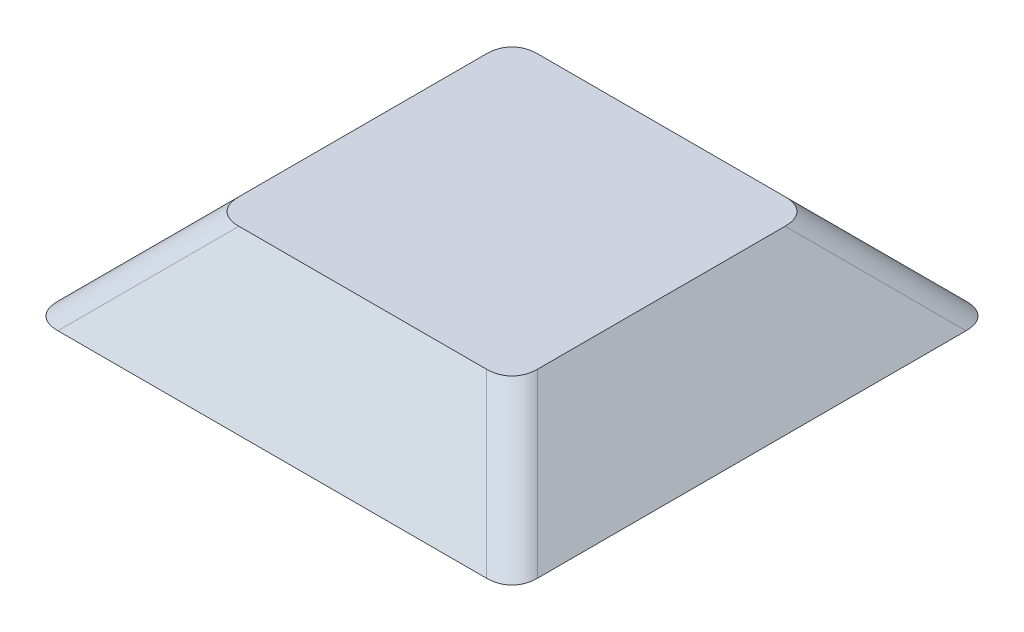
ISO-10303-21;
HEADER;
FILE_DESCRIPTION(('STEP AP214'),'2;1');
FILE_NAME('part.step','',(''),(''),'','','');
FILE_SCHEMA(('AUTOMOTIVE_DESIGN { 1 0 10303 214 1 1 1 1 }'));
ENDSEC;
DATA;
#1=APPLICATION_CONTEXT('core data for automotive mechanical design processes');
#2=APPLICATION_PROTOCOL_DEFINITION('international standard','automotive_design',2000,#1);
#3=PRODUCT_CONTEXT('',#1,'mechanical');
#4=PRODUCT('Part','Part','',(#3));
#5=PRODUCT_RELATED_PRODUCT_CATEGORY('part','',(#4));
#6=PRODUCT_DEFINITION_FORMATION('','',#4);
#7=PRODUCT_DEFINITION_CONTEXT('part definition',#1,'design');
#8=PRODUCT_DEFINITION('design','',#6,#7);
#9=PRODUCT_DEFINITION_SHAPE('','',#8);
#10=(LENGTH_UNIT() NAMED_UNIT(*) SI_UNIT(.MILLI.,.METRE.));
#11=(NAMED_UNIT(*) PLANE_ANGLE_UNIT() SI_UNIT($,.RADIAN.));
#12=(NAMED_UNIT(*) SI_UNIT($,.STERADIAN.) SOLID_ANGLE_UNIT());
#13=UNCERTAINTY_MEASURE_WITH_UNIT(LENGTH_MEASURE(1.E-05),#10,'distance_accuracy_value','');
#14=(GEOMETRIC_REPRESENTATION_CONTEXT(3) GLOBAL_UNCERTAINTY_ASSIGNED_CONTEXT((#13)) GLOBAL_UNIT_ASSIGNED_CONTEXT((#10,
#11,#12)) REPRESENTATION_CONTEXT('',''));
#15=CARTESIAN_POINT('',(0.,0.,0.));
#16=DIRECTION('',(0.,0.,1.));
#17=DIRECTION('',(1.,0.,0.));
#18=AXIS2_PLACEMENT_3D('',#15,#16,#17);
#19=CARTESIAN_POINT('',(0.,20.,0.));
#20=DIRECTION('',(0.,1.,0.));
#21=DIRECTION('',(0.,0.,1.));
#22=AXIS2_PLACEMENT_3D('',#19,#20,#21);
#23=PLANE('',#22);
#24=DIRECTION('',(-1.,0.,0.));
#25=VECTOR('',#24,1.);
#26=CARTESIAN_POINT('',(-53.,20.,-32.9999999999999));
#27=LINE('',#26,#25);
#28=CARTESIAN_POINT('',(27.3431457505076,20.,-32.9999999999999));
#29=VERTEX_POINT('',#28);
#30=CARTESIAN_POINT('',(-27.3431457505075,20.,-32.9999999999999));
#31=VERTEX_POINT('',#30);
#32=EDGE_CURVE('E150',#29,#31,#27,.T.);
#33=ORIENTED_EDGE('',*,*,#32,.T.);
#34=CARTESIAN_POINT('',(-21.6862915010152,20.,-21.6862915010152));
#35=DIRECTION('',(0.,1.,0.));
#36=DIRECTION('',(-0.707106781186548,0.,-0.707106781186547));
#37=AXIS2_PLACEMENT_3D('',#34,#35,#36);
#38=ELLIPSE('',#37,13.856406460551,8.);
#39=CARTESIAN_POINT('',(-32.9999999999999,20.,-27.3431457505076));
#40=VERTEX_POINT('',#39);
#41=EDGE_CURVE('E167',#31,#40,#38,.T.);
#42=ORIENTED_EDGE('',*,*,#41,.T.);
#43=DIRECTION('',(0.,0.,1.));
#44=VECTOR('',#43,1.);
#45=CARTESIAN_POINT('',(-32.9999999999999,20.,53.));
#46=LINE('',#45,#44);
#47=CARTESIAN_POINT('',(-32.9999999999999,20.,27.3431457505075));
#48=VERTEX_POINT('',#47);
#49=EDGE_CURVE('E130',#40,#48,#46,.T.);
#50=ORIENTED_EDGE('',*,*,#49,.T.);
#51=CARTESIAN_POINT('',(-21.6862915010151,20.,21.6862915010151));
#52=DIRECTION('',(0.,1.,0.));
#53=DIRECTION('',(0.707106781186547,0.,-0.707106781186548));
#54=AXIS2_PLACEMENT_3D('',#51,#52,#53);
#55=ELLIPSE('',#54,13.856406460551,8.);
#56=CARTESIAN_POINT('',(-27.3431457505075,20.,32.9999999999999));
#57=VERTEX_POINT('',#56);
#58=EDGE_CURVE('E162',#48,#57,#55,.T.);
#59=ORIENTED_EDGE('',*,*,#58,.T.);
#60=DIRECTION('',(1.,0.,0.));
#61=VECTOR('',#60,1.);
#62=CARTESIAN_POINT('',(53.,20.,32.9999999999999));
#63=LINE('',#62,#61);
#64=CARTESIAN_POINT('',(27.3431457505075,20.,32.9999999999999));
#65=VERTEX_POINT('',#64);
#66=EDGE_CURVE('E141',#57,#65,#63,.T.);
#67=ORIENTED_EDGE('',*,*,#66,.T.);
#68=CARTESIAN_POINT('',(21.6862915010152,20.,21.6862915010151));
#69=DIRECTION('',(0.,1.,0.));
#70=DIRECTION('',(-0.707106781186548,0.,-0.707106781186548));
#71=AXIS2_PLACEMENT_3D('',#68,#69,#70);
#72=ELLIPSE('',#71,13.856406460551,8.);
#73=CARTESIAN_POINT('',(32.9999999999999,20.,27.3431457505075));
#74=VERTEX_POINT('',#73);
#75=EDGE_CURVE('E65',#65,#74,#72,.T.);
#76=ORIENTED_EDGE('',*,*,#75,.T.);
#77=DIRECTION('',(0.,0.,-1.));
#78=VECTOR('',#77,1.);
#79=CARTESIAN_POINT('',(32.9999999999999,20.,-53.));
#80=LINE('',#79,#78);
#81=CARTESIAN_POINT('',(32.9999999999999,20.,-27.3431457505076));
#82=VERTEX_POINT('',#81);
#83=EDGE_CURVE('E148',#74,#82,#80,.T.);
#84=ORIENTED_EDGE('',*,*,#83,.T.);
#85=CARTESIAN_POINT('',(21.6862915010152,20.,-21.6862915010152));
#86=DIRECTION('',(0.,1.,0.));
#87=DIRECTION('',(0.707106781186548,0.,-0.707106781186548));
#88=AXIS2_PLACEMENT_3D('',#85,#86,#87);
#89=ELLIPSE('',#88,13.856406460551,8.);
#90=EDGE_CURVE('E165',#82,#29,#89,.T.);
#91=ORIENTED_EDGE('',*,*,#90,.T.);
#92=EDGE_LOOP('',(#33,#42,#50,#59,#67,#76,#84,#91));
#93=FACE_BOUND('',#92,.T.);
#94=ADVANCED_FACE('F43',(#93),#23,.T.);
#95=CARTESIAN_POINT('',(0.,0.,0.));
#96=DIRECTION('',(0.,1.,0.));
#97=DIRECTION('',(0.,0.,1.));
#98=AXIS2_PLACEMENT_3D('',#95,#96,#97);
#99=PLANE('',#98);
#100=DIRECTION('',(0.,0.,1.));
#101=VECTOR('',#100,1.);
#102=CARTESIAN_POINT('',(-53.,0.,-53.));
#103=LINE('',#102,#101);
#104=CARTESIAN_POINT('',(-53.,0.,-47.3431457505076));
#105=VERTEX_POINT('',#104);
#106=CARTESIAN_POINT('',(-53.,0.,47.3431457505076));
#107=VERTEX_POINT('',#106);
#108=EDGE_CURVE('E127',#105,#107,#103,.T.);
#109=ORIENTED_EDGE('',*,*,#108,.F.);
#110=CARTESIAN_POINT('',(-41.6862915010152,0.,-41.6862915010152));
#111=DIRECTION('',(0.,1.,0.));
#112=DIRECTION('',(-0.707106781186548,0.,-0.707106781186547));
#113=AXIS2_PLACEMENT_3D('',#110,#111,#112);
#114=ELLIPSE('',#113,13.856406460551,8.);
#115=CARTESIAN_POINT('',(-47.3431457505076,0.,-53.));
#116=VERTEX_POINT('',#115);
#117=EDGE_CURVE('E109',#105,#116,#114,.F.);
#118=ORIENTED_EDGE('',*,*,#117,.T.);
#119=DIRECTION('',(-1.,0.,0.));
#120=VECTOR('',#119,1.);
#121=CARTESIAN_POINT('',(-53.,0.,-53.));
#122=LINE('',#121,#120);
#123=CARTESIAN_POINT('',(47.3431457505076,0.,-53.));
#124=VERTEX_POINT('',#123);
#125=EDGE_CURVE('E138',#124,#116,#122,.T.);
#126=ORIENTED_EDGE('',*,*,#125,.F.);
#127=CARTESIAN_POINT('',(41.6862915010152,0.,-41.6862915010152));
#128=DIRECTION('',(0.,1.,0.));
#129=DIRECTION('',(0.707106781186548,0.,-0.707106781186548));
#130=AXIS2_PLACEMENT_3D('',#127,#128,#129);
#131=ELLIPSE('',#130,13.856406460551,8.);
#132=CARTESIAN_POINT('',(53.,0.,-47.3431457505076));
#133=VERTEX_POINT('',#132);
#134=EDGE_CURVE('E120',#124,#133,#131,.F.);
#135=ORIENTED_EDGE('',*,*,#134,.T.);
#136=DIRECTION('',(0.,0.,-1.));
#137=VECTOR('',#136,1.);
#138=CARTESIAN_POINT('',(53.,0.,-53.));
#139=LINE('',#138,#137);
#140=CARTESIAN_POINT('',(53.,0.,47.3431457505076));
#141=VERTEX_POINT('',#140);
#142=EDGE_CURVE('E143',#141,#133,#139,.T.);
#143=ORIENTED_EDGE('',*,*,#142,.F.);
#144=CARTESIAN_POINT('',(41.6862915010152,0.,41.6862915010152));
#145=DIRECTION('',(0.,1.,0.));
#146=DIRECTION('',(-0.707106781186548,0.,-0.707106781186548));
#147=AXIS2_PLACEMENT_3D('',#144,#145,#146);
#148=ELLIPSE('',#147,13.856406460551,8.);
#149=CARTESIAN_POINT('',(47.3431457505076,0.,53.));
#150=VERTEX_POINT('',#149);
#151=EDGE_CURVE('E156',#141,#150,#148,.F.);
#152=ORIENTED_EDGE('',*,*,#151,.T.);
#153=DIRECTION('',(1.,0.,0.));
#154=VECTOR('',#153,1.);
#155=CARTESIAN_POINT('',(-53.,0.,53.));
#156=LINE('',#155,#154);
#157=CARTESIAN_POINT('',(-47.3431457505076,0.,53.));
#158=VERTEX_POINT('',#157);
#159=EDGE_CURVE('E137',#158,#150,#156,.T.);
#160=ORIENTED_EDGE('',*,*,#159,.F.);
#161=CARTESIAN_POINT('',(-41.6862915010151,0.,41.6862915010152));
#162=DIRECTION('',(0.,1.,0.));
#163=DIRECTION('',(0.707106781186547,0.,-0.707106781186548));
#164=AXIS2_PLACEMENT_3D('',#161,#162,#163);
#165=ELLIPSE('',#164,13.856406460551,8.);
#166=EDGE_CURVE('E131',#158,#107,#165,.F.);
#167=ORIENTED_EDGE('',*,*,#166,.T.);
#168=EDGE_LOOP('',(#109,#118,#126,#135,#143,#152,#160,#167));
#169=FACE_BOUND('',#168,.T.);
#170=ADVANCED_FACE('F134',(#169),#99,.F.);
#171=CARTESIAN_POINT('',(32.9999999999999,20.,0.));
#172=DIRECTION('',(0.707106781186547,0.707106781186548,0.));
#173=DIRECTION('',(0.,0.,1.));
#174=AXIS2_PLACEMENT_3D('',#171,#172,#173);
#175=PLANE('',#174);
#176=ORIENTED_EDGE('',*,*,#142,.T.);
#177=DIRECTION('',(0.577350269189626,-0.577350269189626,-0.577350269189626));
#178=VECTOR('',#177,1.);
#179=CARTESIAN_POINT('',(23.8856180831641,29.1143819168359,-18.2287638336717));
#180=LINE('',#179,#178);
#181=EDGE_CURVE('E58',#133,#82,#180,.F.);
#182=ORIENTED_EDGE('',*,*,#181,.T.);
#183=ORIENTED_EDGE('',*,*,#83,.F.);
#184=DIRECTION('',(-0.577350269189626,0.577350269189626,-0.577350269189626));
#185=VECTOR('',#184,1.);
#186=CARTESIAN_POINT('',(23.8856180831641,29.1143819168358,18.2287638336717));
#187=LINE('',#186,#185);
#188=EDGE_CURVE('E169',#74,#141,#187,.F.);
#189=ORIENTED_EDGE('',*,*,#188,.T.);
#190=EDGE_LOOP('',(#176,#182,#183,#189));
#191=FACE_BOUND('',#190,.T.);
#192=ADVANCED_FACE('F186',(#191),#175,.T.);
#193=CARTESIAN_POINT('',(0.,20.,-32.9999999999999));
#194=DIRECTION('',(0.,0.707106781186548,-0.707106781186547));
#195=DIRECTION('',(1.,0.,0.));
#196=AXIS2_PLACEMENT_3D('',#193,#194,#195);
#197=PLANE('',#196);
#198=ORIENTED_EDGE('',*,*,#125,.T.);
#199=DIRECTION('',(-0.577350269189626,-0.577350269189626,-0.577350269189626));
#200=VECTOR('',#199,1.);
#201=CARTESIAN_POINT('',(-18.2287638336717,29.1143819168358,-23.8856180831641));
#202=LINE('',#201,#200);
#203=EDGE_CURVE('E114',#116,#31,#202,.F.);
#204=ORIENTED_EDGE('',*,*,#203,.T.);
#205=ORIENTED_EDGE('',*,*,#32,.F.);
#206=DIRECTION('',(0.577350269189626,-0.577350269189626,-0.577350269189626));
#207=VECTOR('',#206,1.);
#208=CARTESIAN_POINT('',(18.2287638336717,29.1143819168358,-23.8856180831641));
#209=LINE('',#208,#207);
#210=EDGE_CURVE('E119',#29,#124,#209,.T.);
#211=ORIENTED_EDGE('',*,*,#210,.T.);
#212=EDGE_LOOP('',(#198,#204,#205,#211));
#213=FACE_BOUND('',#212,.T.);
#214=ADVANCED_FACE('F183',(#213),#197,.T.);
#215=CARTESIAN_POINT('',(0.,20.,32.9999999999999));
#216=DIRECTION('',(0.,0.707106781186548,0.707106781186547));
#217=DIRECTION('',(-1.,0.,0.));
#218=AXIS2_PLACEMENT_3D('',#215,#216,#217);
#219=PLANE('',#218);
#220=ORIENTED_EDGE('',*,*,#159,.T.);
#221=DIRECTION('',(-0.577350269189626,0.577350269189626,-0.577350269189626));
#222=VECTOR('',#221,1.);
#223=CARTESIAN_POINT('',(18.2287638336717,29.1143819168358,23.8856180831641));
#224=LINE('',#223,#222);
#225=EDGE_CURVE('E11',#150,#65,#224,.T.);
#226=ORIENTED_EDGE('',*,*,#225,.T.);
#227=ORIENTED_EDGE('',*,*,#66,.F.);
#228=DIRECTION('',(0.577350269189626,0.577350269189626,-0.577350269189626));
#229=VECTOR('',#228,1.);
#230=CARTESIAN_POINT('',(-18.2287638336717,29.1143819168358,23.8856180831641));
#231=LINE('',#230,#229);
#232=EDGE_CURVE('E51',#57,#158,#231,.F.);
#233=ORIENTED_EDGE('',*,*,#232,.T.);
#234=EDGE_LOOP('',(#220,#226,#227,#233));
#235=FACE_BOUND('',#234,.T.);
#236=ADVANCED_FACE('F174',(#235),#219,.T.);
#237=CARTESIAN_POINT('',(-32.9999999999999,20.,0.));
#238=DIRECTION('',(-0.707106781186547,0.707106781186548,0.));
#239=DIRECTION('',(0.,0.,-1.));
#240=AXIS2_PLACEMENT_3D('',#237,#238,#239);
#241=PLANE('',#240);
#242=ORIENTED_EDGE('',*,*,#49,.F.);
#243=DIRECTION('',(-0.577350269189626,-0.577350269189626,-0.577350269189626));
#244=VECTOR('',#243,1.);
#245=CARTESIAN_POINT('',(-23.8856180831641,29.1143819168359,-18.2287638336717));
#246=LINE('',#245,#244);
#247=EDGE_CURVE('E113',#40,#105,#246,.T.);
#248=ORIENTED_EDGE('',*,*,#247,.T.);
#249=ORIENTED_EDGE('',*,*,#108,.T.);
#250=DIRECTION('',(0.577350269189626,0.577350269189626,-0.577350269189626));
#251=VECTOR('',#250,1.);
#252=CARTESIAN_POINT('',(-23.8856180831641,29.1143819168358,18.2287638336717));
#253=LINE('',#252,#251);
#254=EDGE_CURVE('E132',#107,#48,#253,.T.);
#255=ORIENTED_EDGE('',*,*,#254,.T.);
#256=EDGE_LOOP('',(#242,#248,#249,#255));
#257=FACE_BOUND('',#256,.T.);
#258=ADVANCED_FACE('F125',(#257),#241,.T.);
#259=CARTESIAN_POINT('',(-18.2287638336717,23.4575276673435,-18.2287638336717));
#260=DIRECTION('',(-0.577350269189626,-0.577350269189626,-0.577350269189626));
#261=DIRECTION('',(-0.707106781186547,0.,0.707106781186548));
#262=AXIS2_PLACEMENT_3D('',#259,#260,#261);
#263=CYLINDRICAL_SURFACE('',#262,8.);
#264=ORIENTED_EDGE('',*,*,#41,.F.);
#265=ORIENTED_EDGE('',*,*,#203,.F.);
#266=ORIENTED_EDGE('',*,*,#117,.F.);
#267=ORIENTED_EDGE('',*,*,#247,.F.);
#268=EDGE_LOOP('',(#264,#265,#266,#267));
#269=FACE_BOUND('',#268,.T.);
#270=ADVANCED_FACE('F112',(#269),#263,.T.);
#271=CARTESIAN_POINT('',(18.2287638336717,23.4575276673435,-18.2287638336717));
#272=DIRECTION('',(0.577350269189626,-0.577350269189626,-0.577350269189626));
#273=DIRECTION('',(-0.707106781186548,0.,-0.707106781186548));
#274=AXIS2_PLACEMENT_3D('',#271,#272,#273);
#275=CYLINDRICAL_SURFACE('',#274,8.);
#276=ORIENTED_EDGE('',*,*,#90,.F.);
#277=ORIENTED_EDGE('',*,*,#181,.F.);
#278=ORIENTED_EDGE('',*,*,#134,.F.);
#279=ORIENTED_EDGE('',*,*,#210,.F.);
#280=EDGE_LOOP('',(#276,#277,#278,#279));
#281=FACE_BOUND('',#280,.T.);
#282=ADVANCED_FACE('F185',(#281),#275,.T.);
#283=CARTESIAN_POINT('',(18.2287638336717,23.4575276673435,18.2287638336717));
#284=DIRECTION('',(-0.577350269189626,0.577350269189626,-0.577350269189626));
#285=DIRECTION('',(-0.707106781186548,0.,0.707106781186548));
#286=AXIS2_PLACEMENT_3D('',#283,#284,#285);
#287=CYLINDRICAL_SURFACE('',#286,8.);
#288=ORIENTED_EDGE('',*,*,#151,.F.);
#289=ORIENTED_EDGE('',*,*,#188,.F.);
#290=ORIENTED_EDGE('',*,*,#75,.F.);
#291=ORIENTED_EDGE('',*,*,#225,.F.);
#292=EDGE_LOOP('',(#288,#289,#290,#291));
#293=FACE_BOUND('',#292,.T.);
#294=ADVANCED_FACE('F189',(#293),#287,.T.);
#295=CARTESIAN_POINT('',(-18.2287638336717,23.4575276673435,18.2287638336717));
#296=DIRECTION('',(0.577350269189626,0.577350269189626,-0.577350269189626));
#297=DIRECTION('',(-0.707106781186548,0.,-0.707106781186547));
#298=AXIS2_PLACEMENT_3D('',#295,#296,#297);
#299=CYLINDRICAL_SURFACE('',#298,8.);
#300=ORIENTED_EDGE('',*,*,#166,.F.);
#301=ORIENTED_EDGE('',*,*,#232,.F.);
#302=ORIENTED_EDGE('',*,*,#58,.F.);
#303=ORIENTED_EDGE('',*,*,#254,.F.);
#304=EDGE_LOOP('',(#300,#301,#302,#303));
#305=FACE_BOUND('',#304,.T.);
#306=ADVANCED_FACE('F45',(#305),#299,.T.);
#307=CLOSED_SHELL('',(#94,#170,#192,#214,#236,#258,#270,#282,#294,#306));
#308=MANIFOLD_SOLID_BREP('B2',#307);
#309=ADVANCED_BREP_SHAPE_REPRESENTATION('',(#18,#308),#14);
#310=SHAPE_DEFINITION_REPRESENTATION(#9,#309);
ENDSEC;
END-ISO-10303-21;
